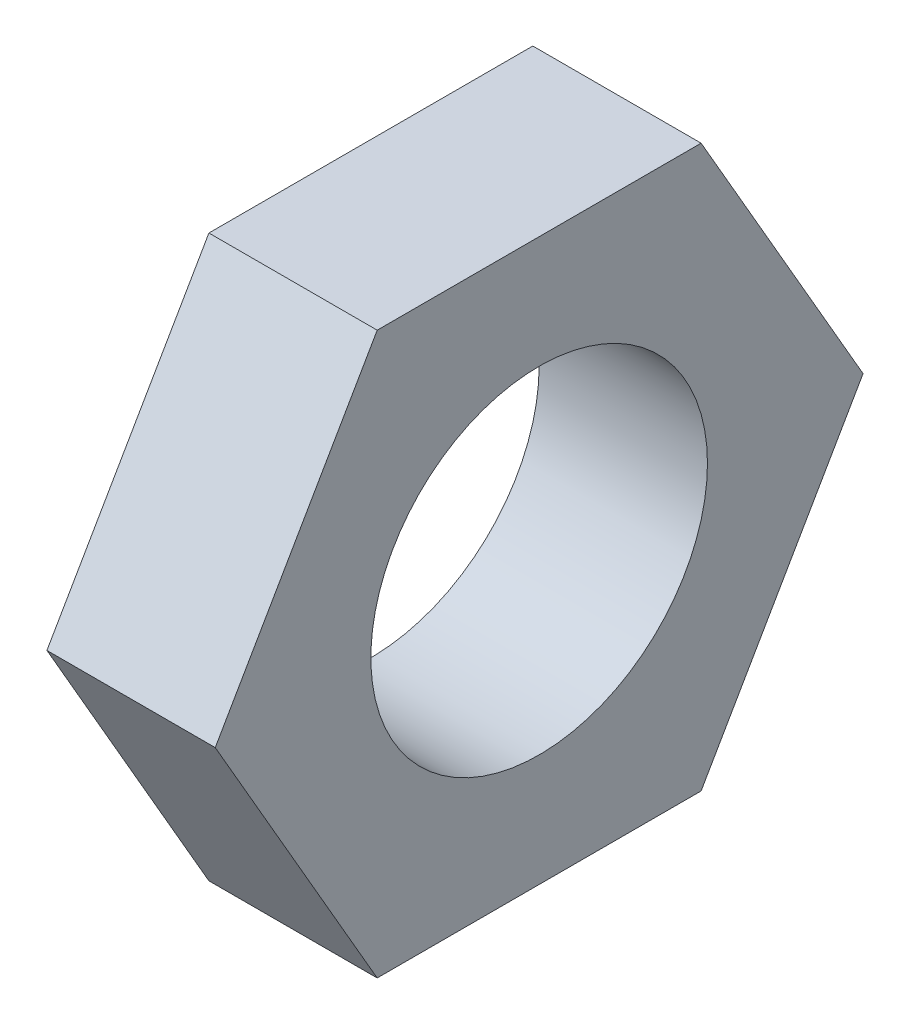
ISO-10303-21;
HEADER;
FILE_DESCRIPTION(('STEP AP214'),'2;1');
FILE_NAME('part.step','',(''),(''),'','','');
FILE_SCHEMA(('AUTOMOTIVE_DESIGN { 1 0 10303 214 1 1 1 1 }'));
ENDSEC;
DATA;
#1=APPLICATION_CONTEXT('core data for automotive mechanical design processes');
#2=APPLICATION_PROTOCOL_DEFINITION('international standard','automotive_design',2000,#1);
#3=PRODUCT_CONTEXT('',#1,'mechanical');
#4=PRODUCT('Part','Part','',(#3));
#5=PRODUCT_RELATED_PRODUCT_CATEGORY('part','',(#4));
#6=PRODUCT_DEFINITION_FORMATION('','',#4);
#7=PRODUCT_DEFINITION_CONTEXT('part definition',#1,'design');
#8=PRODUCT_DEFINITION('design','',#6,#7);
#9=PRODUCT_DEFINITION_SHAPE('','',#8);
#10=(LENGTH_UNIT() NAMED_UNIT(*) SI_UNIT(.MILLI.,.METRE.));
#11=(NAMED_UNIT(*) PLANE_ANGLE_UNIT() SI_UNIT($,.RADIAN.));
#12=(NAMED_UNIT(*) SI_UNIT($,.STERADIAN.) SOLID_ANGLE_UNIT());
#13=UNCERTAINTY_MEASURE_WITH_UNIT(LENGTH_MEASURE(1.E-05),#10,'distance_accuracy_value','');
#14=(GEOMETRIC_REPRESENTATION_CONTEXT(3) GLOBAL_UNCERTAINTY_ASSIGNED_CONTEXT((#13)) GLOBAL_UNIT_ASSIGNED_CONTEXT((#10,
#11,#12)) REPRESENTATION_CONTEXT('',''));
#15=CARTESIAN_POINT('',(0.,0.,0.));
#16=DIRECTION('',(0.,0.,1.));
#17=DIRECTION('',(1.,0.,0.));
#18=AXIS2_PLACEMENT_3D('',#15,#16,#17);
#19=CARTESIAN_POINT('',(23.5,-24.,-22.3867513459481));
#20=DIRECTION('',(0.,-1.,0.));
#21=DIRECTION('',(0.,0.,-1.));
#22=AXIS2_PLACEMENT_3D('',#19,#20,#21);
#23=PLANE('',#22);
#24=DIRECTION('',(0.,0.,1.));
#25=VECTOR('',#24,1.);
#26=CARTESIAN_POINT('',(20.5,-24.,-22.3867513459481));
#27=LINE('',#26,#25);
#28=CARTESIAN_POINT('',(20.5,-24.,-22.3867513459481));
#29=VERTEX_POINT('',#28);
#30=CARTESIAN_POINT('',(20.5,-24.,-16.6132486540519));
#31=VERTEX_POINT('',#30);
#32=EDGE_CURVE('E127',#29,#31,#27,.T.);
#33=ORIENTED_EDGE('',*,*,#32,.T.);
#34=DIRECTION('',(-1.,0.,0.));
#35=VECTOR('',#34,1.);
#36=CARTESIAN_POINT('',(23.5,-24.,-16.6132486540519));
#37=LINE('',#36,#35);
#38=CARTESIAN_POINT('',(23.5,-24.,-16.6132486540519));
#39=VERTEX_POINT('',#38);
#40=EDGE_CURVE('E11',#39,#31,#37,.T.);
#41=ORIENTED_EDGE('',*,*,#40,.F.);
#42=DIRECTION('',(0.,0.,1.));
#43=VECTOR('',#42,1.);
#44=CARTESIAN_POINT('',(23.5,-24.,-22.3867513459481));
#45=LINE('',#44,#43);
#46=CARTESIAN_POINT('',(23.5,-24.,-22.3867513459481));
#47=VERTEX_POINT('',#46);
#48=EDGE_CURVE('E140',#47,#39,#45,.T.);
#49=ORIENTED_EDGE('',*,*,#48,.F.);
#50=DIRECTION('',(-1.,0.,0.));
#51=VECTOR('',#50,1.);
#52=CARTESIAN_POINT('',(23.5,-24.,-22.3867513459481));
#53=LINE('',#52,#51);
#54=EDGE_CURVE('E125',#47,#29,#53,.T.);
#55=ORIENTED_EDGE('',*,*,#54,.T.);
#56=EDGE_LOOP('',(#33,#41,#49,#55));
#57=FACE_BOUND('',#56,.T.);
#58=ADVANCED_FACE('F41',(#57),#23,.F.);
#59=CARTESIAN_POINT('',(23.5,-24.,-16.6132486540519));
#60=DIRECTION('',(0.,-0.5,-0.866025403784439));
#61=DIRECTION('',(0.,0.866025403784439,-0.5));
#62=AXIS2_PLACEMENT_3D('',#59,#60,#61);
#63=PLANE('',#62);
#64=DIRECTION('',(0.,-0.866025403784439,0.5));
#65=VECTOR('',#64,1.);
#66=CARTESIAN_POINT('',(20.5,-24.,-16.6132486540519));
#67=LINE('',#66,#65);
#68=CARTESIAN_POINT('',(20.5,-29.,-13.7264973081037));
#69=VERTEX_POINT('',#68);
#70=EDGE_CURVE('E129',#31,#69,#67,.T.);
#71=ORIENTED_EDGE('',*,*,#70,.T.);
#72=DIRECTION('',(-1.,0.,0.));
#73=VECTOR('',#72,1.);
#74=CARTESIAN_POINT('',(23.5,-29.,-13.7264973081037));
#75=LINE('',#74,#73);
#76=CARTESIAN_POINT('',(23.5,-29.,-13.7264973081037));
#77=VERTEX_POINT('',#76);
#78=EDGE_CURVE('E49',#77,#69,#75,.T.);
#79=ORIENTED_EDGE('',*,*,#78,.F.);
#80=DIRECTION('',(0.,-0.866025403784439,0.5));
#81=VECTOR('',#80,1.);
#82=CARTESIAN_POINT('',(23.5,-24.,-16.6132486540519));
#83=LINE('',#82,#81);
#84=EDGE_CURVE('E92',#39,#77,#83,.T.);
#85=ORIENTED_EDGE('',*,*,#84,.F.);
#86=ORIENTED_EDGE('',*,*,#40,.T.);
#87=EDGE_LOOP('',(#71,#79,#85,#86));
#88=FACE_BOUND('',#87,.T.);
#89=ADVANCED_FACE('F162',(#88),#63,.F.);
#90=CARTESIAN_POINT('',(23.5,-29.,-13.7264973081037));
#91=DIRECTION('',(0.,0.5,-0.866025403784439));
#92=DIRECTION('',(0.,0.866025403784439,0.5));
#93=AXIS2_PLACEMENT_3D('',#90,#91,#92);
#94=PLANE('',#93);
#95=DIRECTION('',(0.,-0.866025403784439,-0.5));
#96=VECTOR('',#95,1.);
#97=CARTESIAN_POINT('',(20.5,-29.,-13.7264973081037));
#98=LINE('',#97,#96);
#99=CARTESIAN_POINT('',(20.5,-34.,-16.6132486540519));
#100=VERTEX_POINT('',#99);
#101=EDGE_CURVE('E132',#69,#100,#98,.T.);
#102=ORIENTED_EDGE('',*,*,#101,.T.);
#103=DIRECTION('',(-1.,0.,0.));
#104=VECTOR('',#103,1.);
#105=CARTESIAN_POINT('',(23.5,-34.,-16.6132486540519));
#106=LINE('',#105,#104);
#107=CARTESIAN_POINT('',(23.5,-34.,-16.6132486540519));
#108=VERTEX_POINT('',#107);
#109=EDGE_CURVE('E117',#108,#100,#106,.T.);
#110=ORIENTED_EDGE('',*,*,#109,.F.);
#111=DIRECTION('',(0.,-0.866025403784439,-0.5));
#112=VECTOR('',#111,1.);
#113=CARTESIAN_POINT('',(23.5,-29.,-13.7264973081037));
#114=LINE('',#113,#112);
#115=EDGE_CURVE('E107',#77,#108,#114,.T.);
#116=ORIENTED_EDGE('',*,*,#115,.F.);
#117=ORIENTED_EDGE('',*,*,#78,.T.);
#118=EDGE_LOOP('',(#102,#110,#116,#117));
#119=FACE_BOUND('',#118,.T.);
#120=ADVANCED_FACE('F145',(#119),#94,.F.);
#121=CARTESIAN_POINT('',(23.5,-34.,-16.6132486540519));
#122=DIRECTION('',(0.,1.,0.));
#123=DIRECTION('',(0.,0.,1.));
#124=AXIS2_PLACEMENT_3D('',#121,#122,#123);
#125=PLANE('',#124);
#126=DIRECTION('',(0.,0.,-1.));
#127=VECTOR('',#126,1.);
#128=CARTESIAN_POINT('',(20.5,-34.,-16.6132486540519));
#129=LINE('',#128,#127);
#130=CARTESIAN_POINT('',(20.5,-34.,-22.3867513459481));
#131=VERTEX_POINT('',#130);
#132=EDGE_CURVE('E116',#100,#131,#129,.T.);
#133=ORIENTED_EDGE('',*,*,#132,.T.);
#134=DIRECTION('',(-1.,0.,0.));
#135=VECTOR('',#134,1.);
#136=CARTESIAN_POINT('',(23.5,-34.,-22.3867513459481));
#137=LINE('',#136,#135);
#138=CARTESIAN_POINT('',(23.5,-34.,-22.3867513459481));
#139=VERTEX_POINT('',#138);
#140=EDGE_CURVE('E114',#139,#131,#137,.T.);
#141=ORIENTED_EDGE('',*,*,#140,.F.);
#142=DIRECTION('',(0.,0.,-1.));
#143=VECTOR('',#142,1.);
#144=CARTESIAN_POINT('',(23.5,-34.,-16.6132486540519));
#145=LINE('',#144,#143);
#146=EDGE_CURVE('E105',#108,#139,#145,.T.);
#147=ORIENTED_EDGE('',*,*,#146,.F.);
#148=ORIENTED_EDGE('',*,*,#109,.T.);
#149=EDGE_LOOP('',(#133,#141,#147,#148));
#150=FACE_BOUND('',#149,.T.);
#151=ADVANCED_FACE('F111',(#150),#125,.F.);
#152=CARTESIAN_POINT('',(23.5,-34.,-22.3867513459481));
#153=DIRECTION('',(0.,0.5,0.866025403784439));
#154=DIRECTION('',(0.,-0.866025403784439,0.5));
#155=AXIS2_PLACEMENT_3D('',#152,#153,#154);
#156=PLANE('',#155);
#157=DIRECTION('',(0.,0.866025403784438,-0.5));
#158=VECTOR('',#157,1.);
#159=CARTESIAN_POINT('',(20.5,-34.,-22.3867513459481));
#160=LINE('',#159,#158);
#161=CARTESIAN_POINT('',(20.5,-29.,-25.2735026918963));
#162=VERTEX_POINT('',#161);
#163=EDGE_CURVE('E81',#131,#162,#160,.T.);
#164=ORIENTED_EDGE('',*,*,#163,.T.);
#165=DIRECTION('',(-1.,0.,0.));
#166=VECTOR('',#165,1.);
#167=CARTESIAN_POINT('',(23.5,-29.,-25.2735026918963));
#168=LINE('',#167,#166);
#169=CARTESIAN_POINT('',(23.5,-29.,-25.2735026918963));
#170=VERTEX_POINT('',#169);
#171=EDGE_CURVE('E119',#170,#162,#168,.T.);
#172=ORIENTED_EDGE('',*,*,#171,.F.);
#173=DIRECTION('',(0.,0.866025403784438,-0.5));
#174=VECTOR('',#173,1.);
#175=CARTESIAN_POINT('',(23.5,-34.,-22.3867513459481));
#176=LINE('',#175,#174);
#177=EDGE_CURVE('E106',#139,#170,#176,.T.);
#178=ORIENTED_EDGE('',*,*,#177,.F.);
#179=ORIENTED_EDGE('',*,*,#140,.T.);
#180=EDGE_LOOP('',(#164,#172,#178,#179));
#181=FACE_BOUND('',#180,.T.);
#182=ADVANCED_FACE('F120',(#181),#156,.F.);
#183=CARTESIAN_POINT('',(23.5,-29.,-25.2735026918963));
#184=DIRECTION('',(0.,-0.5,0.866025403784439));
#185=DIRECTION('',(0.,-0.866025403784439,-0.5));
#186=AXIS2_PLACEMENT_3D('',#183,#184,#185);
#187=PLANE('',#186);
#188=DIRECTION('',(0.,0.866025403784438,0.5));
#189=VECTOR('',#188,1.);
#190=CARTESIAN_POINT('',(20.5,-29.,-25.2735026918963));
#191=LINE('',#190,#189);
#192=EDGE_CURVE('E87',#162,#29,#191,.T.);
#193=ORIENTED_EDGE('',*,*,#192,.T.);
#194=ORIENTED_EDGE('',*,*,#54,.F.);
#195=DIRECTION('',(0.,0.866025403784438,0.5));
#196=VECTOR('',#195,1.);
#197=CARTESIAN_POINT('',(23.5,-29.,-25.2735026918963));
#198=LINE('',#197,#196);
#199=EDGE_CURVE('E59',#170,#47,#198,.T.);
#200=ORIENTED_EDGE('',*,*,#199,.F.);
#201=ORIENTED_EDGE('',*,*,#171,.T.);
#202=EDGE_LOOP('',(#193,#194,#200,#201));
#203=FACE_BOUND('',#202,.T.);
#204=ADVANCED_FACE('F151',(#203),#187,.F.);
#205=CARTESIAN_POINT('',(23.5,0.,0.));
#206=DIRECTION('',(1.,0.,0.));
#207=DIRECTION('',(0.,0.,-1.));
#208=AXIS2_PLACEMENT_3D('',#205,#206,#207);
#209=PLANE('',#208);
#210=CARTESIAN_POINT('',(23.5,-29.,-19.5));
#211=DIRECTION('',(1.,0.,0.));
#212=DIRECTION('',(0.,0.,-1.));
#213=AXIS2_PLACEMENT_3D('',#210,#211,#212);
#214=CIRCLE('',#213,3.);
#215=CARTESIAN_POINT('',(23.5,-29.,-22.5));
#216=VERTEX_POINT('',#215);
#217=EDGE_CURVE('E128',#216,#216,#214,.F.);
#218=ORIENTED_EDGE('',*,*,#217,.T.);
#219=EDGE_LOOP('',(#218));
#220=FACE_BOUND('',#219,.T.);
#221=ORIENTED_EDGE('',*,*,#48,.T.);
#222=ORIENTED_EDGE('',*,*,#84,.T.);
#223=ORIENTED_EDGE('',*,*,#115,.T.);
#224=ORIENTED_EDGE('',*,*,#146,.T.);
#225=ORIENTED_EDGE('',*,*,#177,.T.);
#226=ORIENTED_EDGE('',*,*,#199,.T.);
#227=EDGE_LOOP('',(#221,#222,#223,#224,#225,#226));
#228=FACE_BOUND('',#227,.T.);
#229=ADVANCED_FACE('F102',(#220,#228),#209,.T.);
#230=CARTESIAN_POINT('',(20.5,0.,0.));
#231=DIRECTION('',(1.,0.,0.));
#232=DIRECTION('',(0.,0.,-1.));
#233=AXIS2_PLACEMENT_3D('',#230,#231,#232);
#234=PLANE('',#233);
#235=CARTESIAN_POINT('',(20.5,-29.,-19.5));
#236=DIRECTION('',(1.,0.,0.));
#237=DIRECTION('',(0.,0.,-1.));
#238=AXIS2_PLACEMENT_3D('',#235,#236,#237);
#239=CIRCLE('',#238,3.);
#240=CARTESIAN_POINT('',(20.5,-29.,-22.5));
#241=VERTEX_POINT('',#240);
#242=EDGE_CURVE('E42',#241,#241,#239,.F.);
#243=ORIENTED_EDGE('',*,*,#242,.F.);
#244=EDGE_LOOP('',(#243));
#245=FACE_BOUND('',#244,.T.);
#246=ORIENTED_EDGE('',*,*,#32,.F.);
#247=ORIENTED_EDGE('',*,*,#192,.F.);
#248=ORIENTED_EDGE('',*,*,#163,.F.);
#249=ORIENTED_EDGE('',*,*,#132,.F.);
#250=ORIENTED_EDGE('',*,*,#101,.F.);
#251=ORIENTED_EDGE('',*,*,#70,.F.);
#252=EDGE_LOOP('',(#246,#247,#248,#249,#250,#251));
#253=FACE_BOUND('',#252,.T.);
#254=ADVANCED_FACE('F150',(#245,#253),#234,.F.);
#255=CARTESIAN_POINT('',(23.6,-29.,-19.5));
#256=DIRECTION('',(-1.,0.,0.));
#257=DIRECTION('',(0.,0.,1.));
#258=AXIS2_PLACEMENT_3D('',#255,#256,#257);
#259=CYLINDRICAL_SURFACE('',#258,3.);
#260=ORIENTED_EDGE('',*,*,#217,.F.);
#261=EDGE_LOOP('',(#260));
#262=FACE_BOUND('',#261,.T.);
#263=ORIENTED_EDGE('',*,*,#242,.T.);
#264=EDGE_LOOP('',(#263));
#265=FACE_BOUND('',#264,.T.);
#266=ADVANCED_FACE('F205',(#262,#265),#259,.F.);
#267=CLOSED_SHELL('',(#58,#89,#120,#151,#182,#204,#229,#254,#266));
#268=MANIFOLD_SOLID_BREP('B2',#267);
#269=ADVANCED_BREP_SHAPE_REPRESENTATION('',(#18,#268),#14);
#270=SHAPE_DEFINITION_REPRESENTATION(#9,#269);
ENDSEC;
END-ISO-10303-21;
